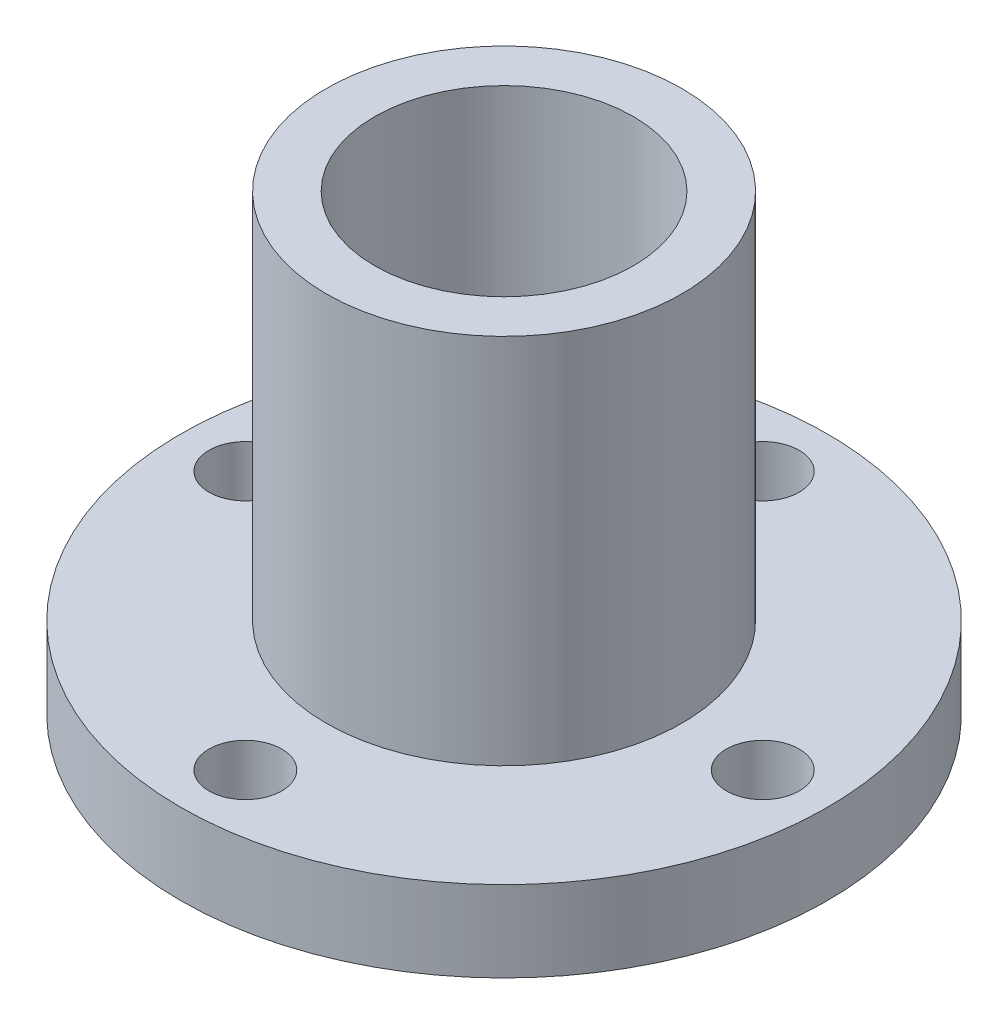
ISO-10303-21;
HEADER;
FILE_DESCRIPTION(('STEP AP214'),'2;1');
FILE_NAME('part.step','',(''),(''),'','','');
FILE_SCHEMA(('AUTOMOTIVE_DESIGN { 1 0 10303 214 1 1 1 1 }'));
ENDSEC;
DATA;
#1=APPLICATION_CONTEXT('core data for automotive mechanical design processes');
#2=APPLICATION_PROTOCOL_DEFINITION('international standard','automotive_design',2000,#1);
#3=PRODUCT_CONTEXT('',#1,'mechanical');
#4=PRODUCT('Part','Part','',(#3));
#5=PRODUCT_RELATED_PRODUCT_CATEGORY('part','',(#4));
#6=PRODUCT_DEFINITION_FORMATION('','',#4);
#7=PRODUCT_DEFINITION_CONTEXT('part definition',#1,'design');
#8=PRODUCT_DEFINITION('design','',#6,#7);
#9=PRODUCT_DEFINITION_SHAPE('','',#8);
#10=(LENGTH_UNIT() NAMED_UNIT(*) SI_UNIT(.MILLI.,.METRE.));
#11=(NAMED_UNIT(*) PLANE_ANGLE_UNIT() SI_UNIT($,.RADIAN.));
#12=(NAMED_UNIT(*) SI_UNIT($,.STERADIAN.) SOLID_ANGLE_UNIT());
#13=UNCERTAINTY_MEASURE_WITH_UNIT(LENGTH_MEASURE(1.E-05),#10,'distance_accuracy_value','');
#14=(GEOMETRIC_REPRESENTATION_CONTEXT(3) GLOBAL_UNCERTAINTY_ASSIGNED_CONTEXT((#13)) GLOBAL_UNIT_ASSIGNED_CONTEXT((#10,
#11,#12)) REPRESENTATION_CONTEXT('',''));
#15=CARTESIAN_POINT('',(0.,0.,0.));
#16=DIRECTION('',(0.,0.,1.));
#17=DIRECTION('',(1.,0.,0.));
#18=AXIS2_PLACEMENT_3D('',#15,#16,#17);
#19=CARTESIAN_POINT('',(0.,28.,0.));
#20=DIRECTION('',(0.,-1.,0.));
#21=DIRECTION('',(0.,0.,-1.));
#22=AXIS2_PLACEMENT_3D('',#19,#20,#21);
#23=CYLINDRICAL_SURFACE('',#22,20.);
#24=CARTESIAN_POINT('',(0.,0.,0.));
#25=DIRECTION('',(0.,1.,0.));
#26=DIRECTION('',(0.,0.,1.));
#27=AXIS2_PLACEMENT_3D('',#24,#25,#26);
#28=CIRCLE('',#27,20.);
#29=CARTESIAN_POINT('',(0.,0.,20.));
#30=VERTEX_POINT('',#29);
#31=EDGE_CURVE('E11',#30,#30,#28,.T.);
#32=ORIENTED_EDGE('',*,*,#31,.T.);
#33=EDGE_LOOP('',(#32));
#34=FACE_BOUND('',#33,.T.);
#35=CARTESIAN_POINT('',(0.,5.,0.));
#36=DIRECTION('',(0.,1.,0.));
#37=DIRECTION('',(0.,0.,1.));
#38=AXIS2_PLACEMENT_3D('',#35,#36,#37);
#39=CIRCLE('',#38,20.);
#40=CARTESIAN_POINT('',(0.,5.,20.));
#41=VERTEX_POINT('',#40);
#42=EDGE_CURVE('E43',#41,#41,#39,.T.);
#43=ORIENTED_EDGE('',*,*,#42,.F.);
#44=EDGE_LOOP('',(#43));
#45=FACE_BOUND('',#44,.T.);
#46=ADVANCED_FACE('F37',(#34,#45),#23,.T.);
#47=CARTESIAN_POINT('',(0.,0.,0.));
#48=DIRECTION('',(0.,1.,0.));
#49=DIRECTION('',(0.,0.,1.));
#50=AXIS2_PLACEMENT_3D('',#47,#48,#49);
#51=PLANE('',#50);
#52=CARTESIAN_POINT('',(0.,0.,16.));
#53=DIRECTION('',(0.,-1.,0.));
#54=DIRECTION('',(0.,0.,-1.));
#55=AXIS2_PLACEMENT_3D('',#52,#53,#54);
#56=CIRCLE('',#55,2.25);
#57=CARTESIAN_POINT('',(0.,0.,13.75));
#58=VERTEX_POINT('',#57);
#59=EDGE_CURVE('E84',#58,#58,#56,.T.);
#60=ORIENTED_EDGE('',*,*,#59,.F.);
#61=EDGE_LOOP('',(#60));
#62=FACE_BOUND('',#61,.T.);
#63=CARTESIAN_POINT('',(16.,0.,0.));
#64=DIRECTION('',(0.,-1.,0.));
#65=DIRECTION('',(0.,0.,-1.));
#66=AXIS2_PLACEMENT_3D('',#63,#64,#65);
#67=CIRCLE('',#66,2.25);
#68=CARTESIAN_POINT('',(16.,0.,-2.25));
#69=VERTEX_POINT('',#68);
#70=EDGE_CURVE('E80',#69,#69,#67,.T.);
#71=ORIENTED_EDGE('',*,*,#70,.F.);
#72=EDGE_LOOP('',(#71));
#73=FACE_BOUND('',#72,.T.);
#74=CARTESIAN_POINT('',(0.,0.,-16.));
#75=DIRECTION('',(0.,-1.,0.));
#76=DIRECTION('',(0.,0.,1.));
#77=AXIS2_PLACEMENT_3D('',#74,#75,#76);
#78=CIRCLE('',#77,2.25);
#79=CARTESIAN_POINT('',(0.,0.,-13.75));
#80=VERTEX_POINT('',#79);
#81=EDGE_CURVE('E71',#80,#80,#78,.T.);
#82=ORIENTED_EDGE('',*,*,#81,.F.);
#83=EDGE_LOOP('',(#82));
#84=FACE_BOUND('',#83,.T.);
#85=CARTESIAN_POINT('',(-16.,0.,0.));
#86=DIRECTION('',(0.,-1.,0.));
#87=DIRECTION('',(0.,0.,1.));
#88=AXIS2_PLACEMENT_3D('',#85,#86,#87);
#89=CIRCLE('',#88,2.25);
#90=CARTESIAN_POINT('',(-16.,0.,2.25));
#91=VERTEX_POINT('',#90);
#92=EDGE_CURVE('E69',#91,#91,#89,.T.);
#93=ORIENTED_EDGE('',*,*,#92,.F.);
#94=EDGE_LOOP('',(#93));
#95=FACE_BOUND('',#94,.T.);
#96=CARTESIAN_POINT('',(0.,0.,0.));
#97=DIRECTION('',(0.,1.,0.));
#98=DIRECTION('',(0.,0.,1.));
#99=AXIS2_PLACEMENT_3D('',#96,#97,#98);
#100=CIRCLE('',#99,8.);
#101=CARTESIAN_POINT('',(0.,0.,8.));
#102=VERTEX_POINT('',#101);
#103=EDGE_CURVE('E54',#102,#102,#100,.T.);
#104=ORIENTED_EDGE('',*,*,#103,.T.);
#105=EDGE_LOOP('',(#104));
#106=FACE_BOUND('',#105,.T.);
#107=ORIENTED_EDGE('',*,*,#31,.F.);
#108=EDGE_LOOP('',(#107));
#109=FACE_BOUND('',#108,.T.);
#110=ADVANCED_FACE('F98',(#62,#73,#84,#95,#106,#109),#51,.F.);
#111=CARTESIAN_POINT('',(0.,5.,0.));
#112=DIRECTION('',(0.,1.,0.));
#113=DIRECTION('',(0.,0.,1.));
#114=AXIS2_PLACEMENT_3D('',#111,#112,#113);
#115=PLANE('',#114);
#116=CARTESIAN_POINT('',(0.,5.,16.));
#117=DIRECTION('',(0.,-1.,0.));
#118=DIRECTION('',(0.,0.,-1.));
#119=AXIS2_PLACEMENT_3D('',#116,#117,#118);
#120=CIRCLE('',#119,2.25);
#121=CARTESIAN_POINT('',(0.,5.,13.75));
#122=VERTEX_POINT('',#121);
#123=EDGE_CURVE('E63',#122,#122,#120,.T.);
#124=ORIENTED_EDGE('',*,*,#123,.T.);
#125=EDGE_LOOP('',(#124));
#126=FACE_BOUND('',#125,.T.);
#127=CARTESIAN_POINT('',(16.,5.,0.));
#128=DIRECTION('',(0.,-1.,0.));
#129=DIRECTION('',(0.,0.,-1.));
#130=AXIS2_PLACEMENT_3D('',#127,#128,#129);
#131=CIRCLE('',#130,2.25);
#132=CARTESIAN_POINT('',(16.,5.,-2.25));
#133=VERTEX_POINT('',#132);
#134=EDGE_CURVE('E78',#133,#133,#131,.T.);
#135=ORIENTED_EDGE('',*,*,#134,.T.);
#136=EDGE_LOOP('',(#135));
#137=FACE_BOUND('',#136,.T.);
#138=CARTESIAN_POINT('',(0.,5.,-16.));
#139=DIRECTION('',(0.,-1.,0.));
#140=DIRECTION('',(0.,0.,1.));
#141=AXIS2_PLACEMENT_3D('',#138,#139,#140);
#142=CIRCLE('',#141,2.25);
#143=CARTESIAN_POINT('',(0.,5.,-13.75));
#144=VERTEX_POINT('',#143);
#145=EDGE_CURVE('E68',#144,#144,#142,.T.);
#146=ORIENTED_EDGE('',*,*,#145,.T.);
#147=EDGE_LOOP('',(#146));
#148=FACE_BOUND('',#147,.T.);
#149=CARTESIAN_POINT('',(-16.,5.,0.));
#150=DIRECTION('',(0.,-1.,0.));
#151=DIRECTION('',(0.,0.,1.));
#152=AXIS2_PLACEMENT_3D('',#149,#150,#151);
#153=CIRCLE('',#152,2.25);
#154=CARTESIAN_POINT('',(-16.,5.,2.25));
#155=VERTEX_POINT('',#154);
#156=EDGE_CURVE('E65',#155,#155,#153,.T.);
#157=ORIENTED_EDGE('',*,*,#156,.T.);
#158=EDGE_LOOP('',(#157));
#159=FACE_BOUND('',#158,.T.);
#160=CARTESIAN_POINT('',(0.,5.,0.));
#161=DIRECTION('',(0.,1.,0.));
#162=DIRECTION('',(0.,0.,1.));
#163=AXIS2_PLACEMENT_3D('',#160,#161,#162);
#164=CIRCLE('',#163,11.);
#165=CARTESIAN_POINT('',(0.,5.,11.));
#166=VERTEX_POINT('',#165);
#167=EDGE_CURVE('E49',#166,#166,#164,.T.);
#168=ORIENTED_EDGE('',*,*,#167,.F.);
#169=EDGE_LOOP('',(#168));
#170=FACE_BOUND('',#169,.T.);
#171=ORIENTED_EDGE('',*,*,#42,.T.);
#172=EDGE_LOOP('',(#171));
#173=FACE_BOUND('',#172,.T.);
#174=ADVANCED_FACE('F86',(#126,#137,#148,#159,#170,#173),#115,.T.);
#175=CARTESIAN_POINT('',(0.,5.,0.));
#176=DIRECTION('',(0.,1.,0.));
#177=DIRECTION('',(0.,0.,1.));
#178=AXIS2_PLACEMENT_3D('',#175,#176,#177);
#179=CYLINDRICAL_SURFACE('',#178,11.);
#180=ORIENTED_EDGE('',*,*,#167,.T.);
#181=EDGE_LOOP('',(#180));
#182=FACE_BOUND('',#181,.T.);
#183=CARTESIAN_POINT('',(0.,28.,0.));
#184=DIRECTION('',(0.,1.,0.));
#185=DIRECTION('',(0.,0.,1.));
#186=AXIS2_PLACEMENT_3D('',#183,#184,#185);
#187=CIRCLE('',#186,11.);
#188=CARTESIAN_POINT('',(0.,28.,11.));
#189=VERTEX_POINT('',#188);
#190=EDGE_CURVE('E55',#189,#189,#187,.T.);
#191=ORIENTED_EDGE('',*,*,#190,.F.);
#192=EDGE_LOOP('',(#191));
#193=FACE_BOUND('',#192,.T.);
#194=ADVANCED_FACE('F116',(#182,#193),#179,.T.);
#195=CARTESIAN_POINT('',(0.,28.,0.));
#196=DIRECTION('',(0.,1.,0.));
#197=DIRECTION('',(0.,0.,1.));
#198=AXIS2_PLACEMENT_3D('',#195,#196,#197);
#199=PLANE('',#198);
#200=CARTESIAN_POINT('',(0.,28.,0.));
#201=DIRECTION('',(0.,1.,0.));
#202=DIRECTION('',(0.,0.,1.));
#203=AXIS2_PLACEMENT_3D('',#200,#201,#202);
#204=CIRCLE('',#203,8.);
#205=CARTESIAN_POINT('',(0.,28.,8.));
#206=VERTEX_POINT('',#205);
#207=EDGE_CURVE('E59',#206,#206,#204,.T.);
#208=ORIENTED_EDGE('',*,*,#207,.F.);
#209=EDGE_LOOP('',(#208));
#210=FACE_BOUND('',#209,.T.);
#211=ORIENTED_EDGE('',*,*,#190,.T.);
#212=EDGE_LOOP('',(#211));
#213=FACE_BOUND('',#212,.T.);
#214=ADVANCED_FACE('F111',(#210,#213),#199,.T.);
#215=CARTESIAN_POINT('',(0.,0.,0.));
#216=DIRECTION('',(0.,1.,0.));
#217=DIRECTION('',(0.,0.,1.));
#218=AXIS2_PLACEMENT_3D('',#215,#216,#217);
#219=CYLINDRICAL_SURFACE('',#218,8.);
#220=ORIENTED_EDGE('',*,*,#103,.F.);
#221=EDGE_LOOP('',(#220));
#222=FACE_BOUND('',#221,.T.);
#223=ORIENTED_EDGE('',*,*,#207,.T.);
#224=EDGE_LOOP('',(#223));
#225=FACE_BOUND('',#224,.T.);
#226=ADVANCED_FACE('F109',(#222,#225),#219,.F.);
#227=CARTESIAN_POINT('',(-16.,5.,0.));
#228=DIRECTION('',(0.,-1.,0.));
#229=DIRECTION('',(0.,0.,-1.));
#230=AXIS2_PLACEMENT_3D('',#227,#228,#229);
#231=CYLINDRICAL_SURFACE('',#230,2.25);
#232=ORIENTED_EDGE('',*,*,#156,.F.);
#233=EDGE_LOOP('',(#232));
#234=FACE_BOUND('',#233,.T.);
#235=ORIENTED_EDGE('',*,*,#92,.T.);
#236=EDGE_LOOP('',(#235));
#237=FACE_BOUND('',#236,.T.);
#238=ADVANCED_FACE('F114',(#234,#237),#231,.F.);
#239=CARTESIAN_POINT('',(0.,5.,-16.));
#240=DIRECTION('',(0.,-1.,0.));
#241=DIRECTION('',(0.,0.,-1.));
#242=AXIS2_PLACEMENT_3D('',#239,#240,#241);
#243=CYLINDRICAL_SURFACE('',#242,2.25);
#244=ORIENTED_EDGE('',*,*,#145,.F.);
#245=EDGE_LOOP('',(#244));
#246=FACE_BOUND('',#245,.T.);
#247=ORIENTED_EDGE('',*,*,#81,.T.);
#248=EDGE_LOOP('',(#247));
#249=FACE_BOUND('',#248,.T.);
#250=ADVANCED_FACE('F163',(#246,#249),#243,.F.);
#251=CARTESIAN_POINT('',(16.,5.,0.));
#252=DIRECTION('',(0.,-1.,0.));
#253=DIRECTION('',(0.,0.,-1.));
#254=AXIS2_PLACEMENT_3D('',#251,#252,#253);
#255=CYLINDRICAL_SURFACE('',#254,2.25);
#256=ORIENTED_EDGE('',*,*,#134,.F.);
#257=EDGE_LOOP('',(#256));
#258=FACE_BOUND('',#257,.T.);
#259=ORIENTED_EDGE('',*,*,#70,.T.);
#260=EDGE_LOOP('',(#259));
#261=FACE_BOUND('',#260,.T.);
#262=ADVANCED_FACE('F94',(#258,#261),#255,.F.);
#263=CARTESIAN_POINT('',(0.,5.,16.));
#264=DIRECTION('',(0.,-1.,0.));
#265=DIRECTION('',(0.,0.,-1.));
#266=AXIS2_PLACEMENT_3D('',#263,#264,#265);
#267=CYLINDRICAL_SURFACE('',#266,2.25);
#268=ORIENTED_EDGE('',*,*,#123,.F.);
#269=EDGE_LOOP('',(#268));
#270=FACE_BOUND('',#269,.T.);
#271=ORIENTED_EDGE('',*,*,#59,.T.);
#272=EDGE_LOOP('',(#271));
#273=FACE_BOUND('',#272,.T.);
#274=ADVANCED_FACE('F93',(#270,#273),#267,.F.);
#275=CLOSED_SHELL('',(#46,#110,#174,#194,#214,#226,#238,#250,#262,#274));
#276=MANIFOLD_SOLID_BREP('B2',#275);
#277=ADVANCED_BREP_SHAPE_REPRESENTATION('',(#18,#276),#14);
#278=SHAPE_DEFINITION_REPRESENTATION(#9,#277);
ENDSEC;
END-ISO-10303-21;
